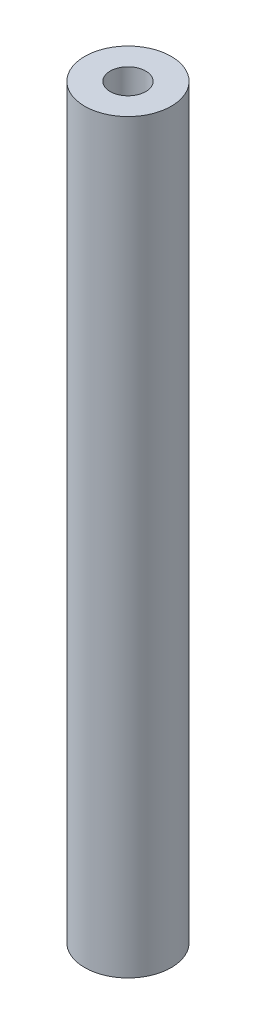
ISO-10303-21;
HEADER;
FILE_DESCRIPTION(('STEP AP214'),'2;1');
FILE_NAME('part.step','',(''),(''),'','','');
FILE_SCHEMA(('AUTOMOTIVE_DESIGN { 1 0 10303 214 1 1 1 1 }'));
ENDSEC;
DATA;
#1=APPLICATION_CONTEXT('core data for automotive mechanical design processes');
#2=APPLICATION_PROTOCOL_DEFINITION('international standard','automotive_design',2000,#1);
#3=PRODUCT_CONTEXT('',#1,'mechanical');
#4=PRODUCT('Part','Part','',(#3));
#5=PRODUCT_RELATED_PRODUCT_CATEGORY('part','',(#4));
#6=PRODUCT_DEFINITION_FORMATION('','',#4);
#7=PRODUCT_DEFINITION_CONTEXT('part definition',#1,'design');
#8=PRODUCT_DEFINITION('design','',#6,#7);
#9=PRODUCT_DEFINITION_SHAPE('','',#8);
#10=(LENGTH_UNIT() NAMED_UNIT(*) SI_UNIT(.MILLI.,.METRE.));
#11=(NAMED_UNIT(*) PLANE_ANGLE_UNIT() SI_UNIT($,.RADIAN.));
#12=(NAMED_UNIT(*) SI_UNIT($,.STERADIAN.) SOLID_ANGLE_UNIT());
#13=UNCERTAINTY_MEASURE_WITH_UNIT(LENGTH_MEASURE(1.E-05),#10,'distance_accuracy_value','');
#14=(GEOMETRIC_REPRESENTATION_CONTEXT(3) GLOBAL_UNCERTAINTY_ASSIGNED_CONTEXT((#13)) GLOBAL_UNIT_ASSIGNED_CONTEXT((#10,
#11,#12)) REPRESENTATION_CONTEXT('',''));
#15=CARTESIAN_POINT('',(0.,0.,0.));
#16=DIRECTION('',(0.,0.,1.));
#17=DIRECTION('',(1.,0.,0.));
#18=AXIS2_PLACEMENT_3D('',#15,#16,#17);
#19=CARTESIAN_POINT('',(0.,220.,0.));
#20=DIRECTION('',(0.,-1.,0.));
#21=DIRECTION('',(0.,0.,-1.));
#22=AXIS2_PLACEMENT_3D('',#19,#20,#21);
#23=CYLINDRICAL_SURFACE('',#22,12.75);
#24=CARTESIAN_POINT('',(0.,220.,0.));
#25=DIRECTION('',(0.,1.,0.));
#26=DIRECTION('',(0.,0.,1.));
#27=AXIS2_PLACEMENT_3D('',#24,#25,#26);
#28=CIRCLE('',#27,12.75);
#29=CARTESIAN_POINT('',(0.,220.,12.75));
#30=VERTEX_POINT('',#29);
#31=EDGE_CURVE('E10',#30,#30,#28,.T.);
#32=ORIENTED_EDGE('',*,*,#31,.F.);
#33=EDGE_LOOP('',(#32));
#34=FACE_BOUND('',#33,.T.);
#35=CARTESIAN_POINT('',(0.,0.,0.));
#36=DIRECTION('',(0.,1.,0.));
#37=DIRECTION('',(0.,0.,1.));
#38=AXIS2_PLACEMENT_3D('',#35,#36,#37);
#39=CIRCLE('',#38,12.75);
#40=CARTESIAN_POINT('',(0.,0.,12.75));
#41=VERTEX_POINT('',#40);
#42=EDGE_CURVE('E51',#41,#41,#39,.T.);
#43=ORIENTED_EDGE('',*,*,#42,.T.);
#44=EDGE_LOOP('',(#43));
#45=FACE_BOUND('',#44,.T.);
#46=ADVANCED_FACE('F43',(#34,#45),#23,.T.);
#47=CARTESIAN_POINT('',(0.,220.,0.));
#48=DIRECTION('',(0.,1.,0.));
#49=DIRECTION('',(0.,0.,1.));
#50=AXIS2_PLACEMENT_3D('',#47,#48,#49);
#51=PLANE('',#50);
#52=CARTESIAN_POINT('',(0.,220.,0.));
#53=DIRECTION('',(0.,1.,0.));
#54=DIRECTION('',(0.,0.,1.));
#55=AXIS2_PLACEMENT_3D('',#52,#53,#54);
#56=CIRCLE('',#55,5.25);
#57=CARTESIAN_POINT('',(0.,220.,5.25));
#58=VERTEX_POINT('',#57);
#59=EDGE_CURVE('E58',#58,#58,#56,.T.);
#60=ORIENTED_EDGE('',*,*,#59,.F.);
#61=EDGE_LOOP('',(#60));
#62=FACE_BOUND('',#61,.T.);
#63=ORIENTED_EDGE('',*,*,#31,.T.);
#64=EDGE_LOOP('',(#63));
#65=FACE_BOUND('',#64,.T.);
#66=ADVANCED_FACE('F76',(#62,#65),#51,.T.);
#67=CARTESIAN_POINT('',(0.,0.,0.));
#68=DIRECTION('',(0.,1.,0.));
#69=DIRECTION('',(0.,0.,1.));
#70=AXIS2_PLACEMENT_3D('',#67,#68,#69);
#71=PLANE('',#70);
#72=CARTESIAN_POINT('',(0.,0.,0.));
#73=DIRECTION('',(0.,1.,0.));
#74=DIRECTION('',(0.,0.,1.));
#75=AXIS2_PLACEMENT_3D('',#72,#73,#74);
#76=CIRCLE('',#75,5.25);
#77=CARTESIAN_POINT('',(0.,0.,5.25));
#78=VERTEX_POINT('',#77);
#79=EDGE_CURVE('E46',#78,#78,#76,.T.);
#80=ORIENTED_EDGE('',*,*,#79,.T.);
#81=EDGE_LOOP('',(#80));
#82=FACE_BOUND('',#81,.T.);
#83=ORIENTED_EDGE('',*,*,#42,.F.);
#84=EDGE_LOOP('',(#83));
#85=FACE_BOUND('',#84,.T.);
#86=ADVANCED_FACE('F67',(#82,#85),#71,.F.);
#87=CARTESIAN_POINT('',(0.,-1.2E-05,0.));
#88=DIRECTION('',(0.,1.,0.));
#89=DIRECTION('',(0.,0.,1.));
#90=AXIS2_PLACEMENT_3D('',#87,#88,#89);
#91=CYLINDRICAL_SURFACE('',#90,5.25);
#92=CARTESIAN_POINT('',(0.,220.,5.25));
#93=CARTESIAN_POINT('',(0.,217.708333333333,5.25));
#94=CARTESIAN_POINT('',(0.,215.416666666667,5.25));
#95=CARTESIAN_POINT('',(0.,210.833333333333,5.25));
#96=CARTESIAN_POINT('',(0.,208.541666666667,5.25));
#97=CARTESIAN_POINT('',(0.,203.958333333333,5.25));
#98=CARTESIAN_POINT('',(0.,201.666666666667,5.25));
#99=CARTESIAN_POINT('',(0.,197.083333333333,5.25));
#100=CARTESIAN_POINT('',(0.,194.791666666667,5.25));
#101=CARTESIAN_POINT('',(0.,190.208333333333,5.25));
#102=CARTESIAN_POINT('',(0.,187.916666666667,5.25));
#103=CARTESIAN_POINT('',(0.,183.333333333333,5.25));
#104=CARTESIAN_POINT('',(0.,181.041666666667,5.25));
#105=CARTESIAN_POINT('',(0.,176.458333333333,5.25));
#106=CARTESIAN_POINT('',(0.,174.166666666667,5.25));
#107=CARTESIAN_POINT('',(0.,169.583333333333,5.25));
#108=CARTESIAN_POINT('',(0.,167.291666666667,5.25));
#109=CARTESIAN_POINT('',(0.,162.708333333333,5.25));
#110=CARTESIAN_POINT('',(0.,160.416666666667,5.25));
#111=CARTESIAN_POINT('',(0.,155.833333333333,5.25));
#112=CARTESIAN_POINT('',(0.,153.541666666667,5.25));
#113=CARTESIAN_POINT('',(0.,148.958333333333,5.25));
#114=CARTESIAN_POINT('',(0.,146.666666666667,5.25));
#115=CARTESIAN_POINT('',(0.,142.083333333333,5.25));
#116=CARTESIAN_POINT('',(0.,139.791666666667,5.25));
#117=CARTESIAN_POINT('',(0.,135.208333333333,5.25));
#118=CARTESIAN_POINT('',(0.,132.916666666667,5.25));
#119=CARTESIAN_POINT('',(0.,128.333333333333,5.25));
#120=CARTESIAN_POINT('',(0.,126.041666666667,5.25));
#121=CARTESIAN_POINT('',(0.,121.458333333333,5.25));
#122=CARTESIAN_POINT('',(0.,119.166666666667,5.25));
#123=CARTESIAN_POINT('',(0.,114.583333333333,5.25));
#124=CARTESIAN_POINT('',(0.,112.291666666667,5.25));
#125=CARTESIAN_POINT('',(0.,107.708333333333,5.25));
#126=CARTESIAN_POINT('',(0.,105.416666666667,5.25));
#127=CARTESIAN_POINT('',(0.,100.833333333333,5.25));
#128=CARTESIAN_POINT('',(0.,98.5416666666667,5.25));
#129=CARTESIAN_POINT('',(0.,93.9583333333333,5.25));
#130=CARTESIAN_POINT('',(0.,91.6666666666667,5.25));
#131=CARTESIAN_POINT('',(0.,87.0833333333333,5.25));
#132=CARTESIAN_POINT('',(0.,84.7916666666667,5.25));
#133=CARTESIAN_POINT('',(0.,80.2083333333333,5.25));
#134=CARTESIAN_POINT('',(0.,77.9166666666667,5.25));
#135=CARTESIAN_POINT('',(0.,73.3333333333333,5.25));
#136=CARTESIAN_POINT('',(0.,71.0416666666667,5.25));
#137=CARTESIAN_POINT('',(0.,66.4583333333333,5.25));
#138=CARTESIAN_POINT('',(0.,64.1666666666667,5.25));
#139=CARTESIAN_POINT('',(0.,59.5833333333333,5.25));
#140=CARTESIAN_POINT('',(0.,57.2916666666667,5.25));
#141=CARTESIAN_POINT('',(0.,52.7083333333333,5.25));
#142=CARTESIAN_POINT('',(0.,50.4166666666667,5.25));
#143=CARTESIAN_POINT('',(0.,45.8333333333333,5.25));
#144=CARTESIAN_POINT('',(0.,43.5416666666667,5.25));
#145=CARTESIAN_POINT('',(0.,38.9583333333333,5.25));
#146=CARTESIAN_POINT('',(0.,36.6666666666667,5.25));
#147=CARTESIAN_POINT('',(0.,32.0833333333333,5.25));
#148=CARTESIAN_POINT('',(0.,29.7916666666667,5.25));
#149=CARTESIAN_POINT('',(0.,25.2083333333333,5.25));
#150=CARTESIAN_POINT('',(0.,22.9166666666667,5.25));
#151=CARTESIAN_POINT('',(0.,18.3333333333333,5.25));
#152=CARTESIAN_POINT('',(0.,16.0416666666667,5.25));
#153=CARTESIAN_POINT('',(0.,11.4583333333333,5.25));
#154=CARTESIAN_POINT('',(0.,9.16666666666666,5.25));
#155=CARTESIAN_POINT('',(0.,4.58333333333332,5.25));
#156=CARTESIAN_POINT('',(0.,2.29166666666666,5.25));
#157=CARTESIAN_POINT('',(0.,0.,5.25));
#158=B_SPLINE_CURVE_WITH_KNOTS('',3,(#92,#93,#94,#95,#96,#97,#98,#99,#100,#101,#102,#103,#104,
#105,#106,#107,#108,#109,#110,#111,#112,#113,#114,#115,#116,#117,#118,#119,#120,#121,#122,#123,
#124,#125,#126,#127,#128,#129,#130,#131,#132,#133,#134,#135,#136,#137,#138,#139,#140,#141,#142,
#143,#144,#145,#146,#147,#148,#149,#150,#151,#152,#153,#154,#155,#156,#157),.UNSPECIFIED.,.F.,
.F.,(4,2,2,2,2,2,2,2,2,2,2,2,2,2,2,2,2,2,2,2,2,2,2,2,2,2,2,2,2,2,2,2,4),(0.,6.87499999999999,
13.75,20.625,27.5,34.375,41.25,48.125,55.,61.875,68.75,75.625,82.5,89.375,96.25,103.125,110.,
116.875,123.75,130.625,137.5,144.375,151.25,158.125,165.,171.875,178.75,185.625,192.5,199.375,
206.25,213.125,220.),.UNSPECIFIED.);
#159=EDGE_CURVE('BSEAM70',#58,#78,#158,.T.);
#160=ORIENTED_EDGE('',*,*,#59,.T.);
#161=ORIENTED_EDGE('',*,*,#79,.F.);
#162=ORIENTED_EDGE('',*,*,#159,.T.);
#163=ORIENTED_EDGE('',*,*,#159,.F.);
#164=EDGE_LOOP('',(#160,#162,#161,#163));
#165=FACE_BOUND('',#164,.T.);
#166=ADVANCED_FACE('F70',(#165),#91,.F.);
#167=CLOSED_SHELL('',(#46,#66,#86,#166));
#168=MANIFOLD_SOLID_BREP('B2',#167);
#169=ADVANCED_BREP_SHAPE_REPRESENTATION('',(#18,#168),#14);
#170=SHAPE_DEFINITION_REPRESENTATION(#9,#169);
ENDSEC;
END-ISO-10303-21;
